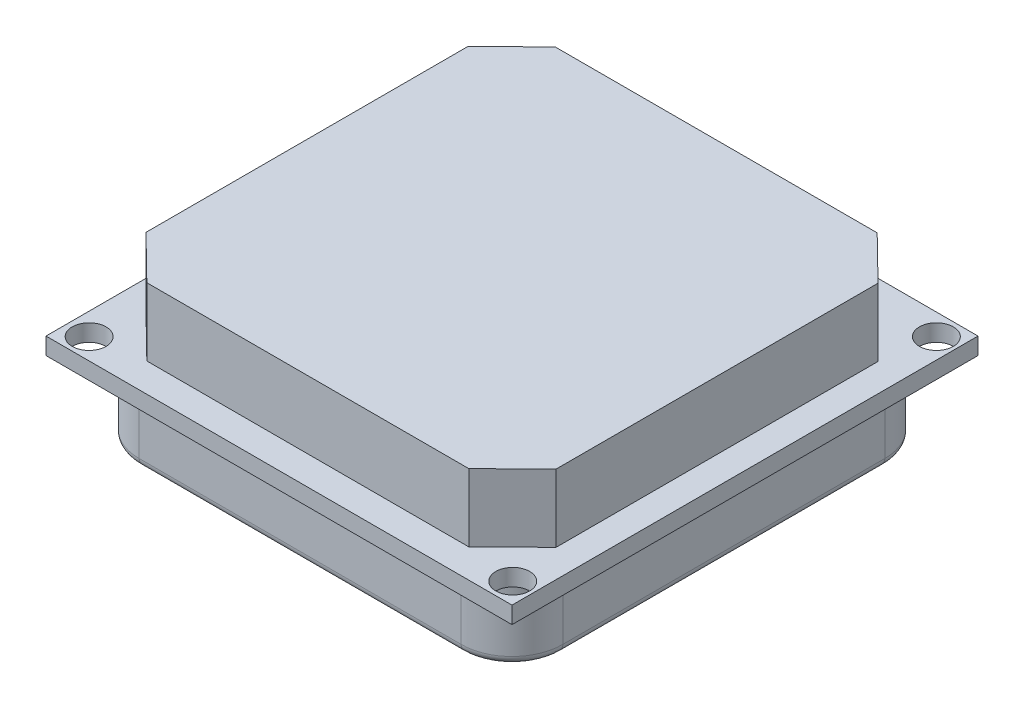
ISO-10303-21;
HEADER;
FILE_DESCRIPTION(('STEP AP214'),'2;1');
FILE_NAME('part.step','',(''),(''),'','','');
FILE_SCHEMA(('AUTOMOTIVE_DESIGN { 1 0 10303 214 1 1 1 1 }'));
ENDSEC;
DATA;
#1=APPLICATION_CONTEXT('core data for automotive mechanical design processes');
#2=APPLICATION_PROTOCOL_DEFINITION('international standard','automotive_design',2000,#1);
#3=PRODUCT_CONTEXT('',#1,'mechanical');
#4=PRODUCT('Part','Part','',(#3));
#5=PRODUCT_RELATED_PRODUCT_CATEGORY('part','',(#4));
#6=PRODUCT_DEFINITION_FORMATION('','',#4);
#7=PRODUCT_DEFINITION_CONTEXT('part definition',#1,'design');
#8=PRODUCT_DEFINITION('design','',#6,#7);
#9=PRODUCT_DEFINITION_SHAPE('','',#8);
#10=(LENGTH_UNIT() NAMED_UNIT(*) SI_UNIT(.MILLI.,.METRE.));
#11=(NAMED_UNIT(*) PLANE_ANGLE_UNIT() SI_UNIT($,.RADIAN.));
#12=(NAMED_UNIT(*) SI_UNIT($,.STERADIAN.) SOLID_ANGLE_UNIT());
#13=UNCERTAINTY_MEASURE_WITH_UNIT(LENGTH_MEASURE(1.E-05),#10,'distance_accuracy_value','');
#14=(GEOMETRIC_REPRESENTATION_CONTEXT(3) GLOBAL_UNCERTAINTY_ASSIGNED_CONTEXT((#13)) GLOBAL_UNIT_ASSIGNED_CONTEXT((#10,
#11,#12)) REPRESENTATION_CONTEXT('',''));
#15=CARTESIAN_POINT('',(0.,0.,0.));
#16=DIRECTION('',(0.,0.,1.));
#17=DIRECTION('',(1.,0.,0.));
#18=AXIS2_PLACEMENT_3D('',#15,#16,#17);
#19=CARTESIAN_POINT('',(0.,0.,0.));
#20=DIRECTION('',(0.,1.,0.));
#21=DIRECTION('',(0.,0.,1.));
#22=AXIS2_PLACEMENT_3D('',#19,#20,#21);
#23=PLANE('',#22);
#24=DIRECTION('',(-1.,0.,0.));
#25=VECTOR('',#24,1.);
#26=CARTESIAN_POINT('',(13.75,0.,-13.75));
#27=LINE('',#26,#25);
#28=CARTESIAN_POINT('',(13.75,0.,-13.75));
#29=VERTEX_POINT('',#28);
#30=CARTESIAN_POINT('',(-13.75,0.,-13.75));
#31=VERTEX_POINT('',#30);
#32=EDGE_CURVE('E366',#29,#31,#27,.T.);
#33=ORIENTED_EDGE('',*,*,#32,.F.);
#34=DIRECTION('',(0.,0.,-1.));
#35=VECTOR('',#34,1.);
#36=CARTESIAN_POINT('',(13.75,0.,-13.75));
#37=LINE('',#36,#35);
#38=CARTESIAN_POINT('',(13.75,0.,13.75));
#39=VERTEX_POINT('',#38);
#40=EDGE_CURVE('E375',#39,#29,#37,.T.);
#41=ORIENTED_EDGE('',*,*,#40,.F.);
#42=DIRECTION('',(1.,0.,0.));
#43=VECTOR('',#42,1.);
#44=CARTESIAN_POINT('',(13.75,0.,13.75));
#45=LINE('',#44,#43);
#46=CARTESIAN_POINT('',(-13.75,0.,13.75));
#47=VERTEX_POINT('',#46);
#48=EDGE_CURVE('E391',#47,#39,#45,.T.);
#49=ORIENTED_EDGE('',*,*,#48,.F.);
#50=DIRECTION('',(0.,0.,1.));
#51=VECTOR('',#50,1.);
#52=CARTESIAN_POINT('',(-13.75,0.,-13.75));
#53=LINE('',#52,#51);
#54=EDGE_CURVE('E388',#31,#47,#53,.T.);
#55=ORIENTED_EDGE('',*,*,#54,.F.);
#56=EDGE_LOOP('',(#33,#41,#49,#55));
#57=FACE_BOUND('',#56,.T.);
#58=CARTESIAN_POINT('',(-12.4479717343854,0.,-12.4920969026307));
#59=DIRECTION('',(0.,1.,0.));
#60=DIRECTION('',(0.,0.,1.));
#61=AXIS2_PLACEMENT_3D('',#58,#59,#60);
#62=CIRCLE('',#61,1.);
#63=CARTESIAN_POINT('',(-12.4479717343854,0.,-11.4920969026307));
#64=VERTEX_POINT('',#63);
#65=EDGE_CURVE('E362',#64,#64,#62,.T.);
#66=ORIENTED_EDGE('',*,*,#65,.T.);
#67=EDGE_LOOP('',(#66));
#68=FACE_BOUND('',#67,.T.);
#69=CARTESIAN_POINT('',(12.5520282656146,0.,-12.4920969026307));
#70=DIRECTION('',(0.,1.,0.));
#71=DIRECTION('',(0.,0.,1.));
#72=AXIS2_PLACEMENT_3D('',#69,#70,#71);
#73=CIRCLE('',#72,1.);
#74=CARTESIAN_POINT('',(12.5520282656146,0.,-11.4920969026307));
#75=VERTEX_POINT('',#74);
#76=EDGE_CURVE('E338',#75,#75,#73,.T.);
#77=ORIENTED_EDGE('',*,*,#76,.T.);
#78=EDGE_LOOP('',(#77));
#79=FACE_BOUND('',#78,.T.);
#80=CARTESIAN_POINT('',(12.5520282656146,0.,12.5079030973693));
#81=DIRECTION('',(0.,1.,0.));
#82=DIRECTION('',(0.,0.,1.));
#83=AXIS2_PLACEMENT_3D('',#80,#81,#82);
#84=CIRCLE('',#83,1.);
#85=CARTESIAN_POINT('',(12.5520282656146,0.,13.5079030973693));
#86=VERTEX_POINT('',#85);
#87=EDGE_CURVE('E347',#86,#86,#84,.T.);
#88=ORIENTED_EDGE('',*,*,#87,.T.);
#89=EDGE_LOOP('',(#88));
#90=FACE_BOUND('',#89,.T.);
#91=CARTESIAN_POINT('',(-12.4479717343854,0.,12.5079030973693));
#92=DIRECTION('',(0.,1.,0.));
#93=DIRECTION('',(0.,0.,1.));
#94=AXIS2_PLACEMENT_3D('',#91,#92,#93);
#95=CIRCLE('',#94,1.);
#96=CARTESIAN_POINT('',(-12.4479717343854,0.,13.5079030973693));
#97=VERTEX_POINT('',#96);
#98=EDGE_CURVE('E355',#97,#97,#95,.T.);
#99=ORIENTED_EDGE('',*,*,#98,.T.);
#100=EDGE_LOOP('',(#99));
#101=FACE_BOUND('',#100,.T.);
#102=CARTESIAN_POINT('',(-9.5,0.,9.5));
#103=DIRECTION('',(0.,-1.,0.));
#104=DIRECTION('',(0.,0.,1.));
#105=AXIS2_PLACEMENT_3D('',#102,#103,#104);
#106=CIRCLE('',#105,3.);
#107=CARTESIAN_POINT('',(-9.5,0.,12.5));
#108=VERTEX_POINT('',#107);
#109=CARTESIAN_POINT('',(-12.5,0.,9.5));
#110=VERTEX_POINT('',#109);
#111=EDGE_CURVE('E206',#108,#110,#106,.T.);
#112=ORIENTED_EDGE('',*,*,#111,.F.);
#113=DIRECTION('',(-1.,0.,0.));
#114=VECTOR('',#113,1.);
#115=CARTESIAN_POINT('',(-9.5,0.,12.5));
#116=LINE('',#115,#114);
#117=CARTESIAN_POINT('',(9.5,0.,12.5));
#118=VERTEX_POINT('',#117);
#119=EDGE_CURVE('E213',#118,#108,#116,.T.);
#120=ORIENTED_EDGE('',*,*,#119,.F.);
#121=CARTESIAN_POINT('',(9.5,0.,9.5));
#122=DIRECTION('',(0.,-1.,0.));
#123=DIRECTION('',(0.,0.,1.));
#124=AXIS2_PLACEMENT_3D('',#121,#122,#123);
#125=CIRCLE('',#124,3.00000000000001);
#126=CARTESIAN_POINT('',(12.5,0.,9.5));
#127=VERTEX_POINT('',#126);
#128=EDGE_CURVE('E229',#127,#118,#125,.T.);
#129=ORIENTED_EDGE('',*,*,#128,.F.);
#130=DIRECTION('',(0.,0.,1.));
#131=VECTOR('',#130,1.);
#132=CARTESIAN_POINT('',(12.5,0.,9.5));
#133=LINE('',#132,#131);
#134=CARTESIAN_POINT('',(12.5,0.,-9.5));
#135=VERTEX_POINT('',#134);
#136=EDGE_CURVE('E232',#135,#127,#133,.T.);
#137=ORIENTED_EDGE('',*,*,#136,.F.);
#138=CARTESIAN_POINT('',(9.49999999999999,0.,-9.5));
#139=DIRECTION('',(0.,-1.,0.));
#140=DIRECTION('',(0.,0.,1.));
#141=AXIS2_PLACEMENT_3D('',#138,#139,#140);
#142=CIRCLE('',#141,3.00000000000001);
#143=CARTESIAN_POINT('',(9.5,0.,-12.5));
#144=VERTEX_POINT('',#143);
#145=EDGE_CURVE('E508',#144,#135,#142,.T.);
#146=ORIENTED_EDGE('',*,*,#145,.F.);
#147=DIRECTION('',(1.,0.,0.));
#148=VECTOR('',#147,1.);
#149=CARTESIAN_POINT('',(9.5,0.,-12.5));
#150=LINE('',#149,#148);
#151=CARTESIAN_POINT('',(-9.5,0.,-12.5));
#152=VERTEX_POINT('',#151);
#153=EDGE_CURVE('E504',#152,#144,#150,.T.);
#154=ORIENTED_EDGE('',*,*,#153,.F.);
#155=CARTESIAN_POINT('',(-9.5,0.,-9.50000000000001));
#156=DIRECTION('',(0.,-1.,0.));
#157=DIRECTION('',(0.,0.,1.));
#158=AXIS2_PLACEMENT_3D('',#155,#156,#157);
#159=CIRCLE('',#158,2.99999999999999);
#160=CARTESIAN_POINT('',(-12.5,0.,-9.5));
#161=VERTEX_POINT('',#160);
#162=EDGE_CURVE('E500',#161,#152,#159,.T.);
#163=ORIENTED_EDGE('',*,*,#162,.F.);
#164=DIRECTION('',(0.,0.,-1.));
#165=VECTOR('',#164,1.);
#166=CARTESIAN_POINT('',(-12.5,0.,-9.5));
#167=LINE('',#166,#165);
#168=EDGE_CURVE('E222',#110,#161,#167,.T.);
#169=ORIENTED_EDGE('',*,*,#168,.F.);
#170=EDGE_LOOP('',(#112,#120,#129,#137,#146,#154,#163,#169));
#171=FACE_BOUND('',#170,.T.);
#172=ADVANCED_FACE('F39',(#57,#68,#79,#90,#101,#171),#23,.F.);
#173=CARTESIAN_POINT('',(0.,1.,0.));
#174=DIRECTION('',(0.,1.,0.));
#175=DIRECTION('',(0.,0.,1.));
#176=AXIS2_PLACEMENT_3D('',#173,#174,#175);
#177=PLANE('',#176);
#178=CARTESIAN_POINT('',(-12.4479717343854,1.,12.5079030973693));
#179=DIRECTION('',(0.,1.,0.));
#180=DIRECTION('',(0.,0.,1.));
#181=AXIS2_PLACEMENT_3D('',#178,#179,#180);
#182=CIRCLE('',#181,1.);
#183=CARTESIAN_POINT('',(-12.4479717343854,1.,13.5079030973693));
#184=VERTEX_POINT('',#183);
#185=EDGE_CURVE('E337',#184,#184,#182,.T.);
#186=ORIENTED_EDGE('',*,*,#185,.F.);
#187=EDGE_LOOP('',(#186));
#188=FACE_BOUND('',#187,.T.);
#189=CARTESIAN_POINT('',(12.5520282656146,1.,12.5079030973693));
#190=DIRECTION('',(0.,1.,0.));
#191=DIRECTION('',(0.,0.,1.));
#192=AXIS2_PLACEMENT_3D('',#189,#190,#191);
#193=CIRCLE('',#192,1.);
#194=CARTESIAN_POINT('',(12.5520282656146,1.,13.5079030973693));
#195=VERTEX_POINT('',#194);
#196=EDGE_CURVE('E351',#195,#195,#193,.T.);
#197=ORIENTED_EDGE('',*,*,#196,.F.);
#198=EDGE_LOOP('',(#197));
#199=FACE_BOUND('',#198,.T.);
#200=CARTESIAN_POINT('',(12.5520282656146,1.,-12.4920969026307));
#201=DIRECTION('',(0.,1.,0.));
#202=DIRECTION('',(0.,0.,1.));
#203=AXIS2_PLACEMENT_3D('',#200,#201,#202);
#204=CIRCLE('',#203,1.);
#205=CARTESIAN_POINT('',(12.5520282656146,1.,-11.4920969026307));
#206=VERTEX_POINT('',#205);
#207=EDGE_CURVE('E343',#206,#206,#204,.T.);
#208=ORIENTED_EDGE('',*,*,#207,.F.);
#209=EDGE_LOOP('',(#208));
#210=FACE_BOUND('',#209,.T.);
#211=CARTESIAN_POINT('',(-12.4479717343854,1.,-12.4920969026307));
#212=DIRECTION('',(0.,1.,0.));
#213=DIRECTION('',(0.,0.,1.));
#214=AXIS2_PLACEMENT_3D('',#211,#212,#213);
#215=CIRCLE('',#214,1.);
#216=CARTESIAN_POINT('',(-12.4479717343854,1.,-11.4920969026307));
#217=VERTEX_POINT('',#216);
#218=EDGE_CURVE('E342',#217,#217,#215,.T.);
#219=ORIENTED_EDGE('',*,*,#218,.F.);
#220=EDGE_LOOP('',(#219));
#221=FACE_BOUND('',#220,.T.);
#222=DIRECTION('',(-1.,0.,0.));
#223=VECTOR('',#222,1.);
#224=CARTESIAN_POINT('',(13.75,1.,-13.75));
#225=LINE('',#224,#223);
#226=CARTESIAN_POINT('',(13.75,1.,-13.75));
#227=VERTEX_POINT('',#226);
#228=CARTESIAN_POINT('',(-13.75,1.,-13.75));
#229=VERTEX_POINT('',#228);
#230=EDGE_CURVE('E370',#227,#229,#225,.T.);
#231=ORIENTED_EDGE('',*,*,#230,.T.);
#232=DIRECTION('',(0.,0.,1.));
#233=VECTOR('',#232,1.);
#234=CARTESIAN_POINT('',(-13.75,1.,-13.75));
#235=LINE('',#234,#233);
#236=CARTESIAN_POINT('',(-13.75,1.,13.75));
#237=VERTEX_POINT('',#236);
#238=EDGE_CURVE('E374',#229,#237,#235,.T.);
#239=ORIENTED_EDGE('',*,*,#238,.T.);
#240=DIRECTION('',(1.,0.,0.));
#241=VECTOR('',#240,1.);
#242=CARTESIAN_POINT('',(13.75,1.,13.75));
#243=LINE('',#242,#241);
#244=CARTESIAN_POINT('',(13.75,1.,13.75));
#245=VERTEX_POINT('',#244);
#246=EDGE_CURVE('E378',#237,#245,#243,.T.);
#247=ORIENTED_EDGE('',*,*,#246,.T.);
#248=DIRECTION('',(0.,0.,-1.));
#249=VECTOR('',#248,1.);
#250=CARTESIAN_POINT('',(13.75,1.,-13.75));
#251=LINE('',#250,#249);
#252=EDGE_CURVE('E381',#245,#227,#251,.T.);
#253=ORIENTED_EDGE('',*,*,#252,.T.);
#254=EDGE_LOOP('',(#231,#239,#247,#253));
#255=FACE_BOUND('',#254,.T.);
#256=DIRECTION('',(0.713938248596245,0.,0.700208666892468));
#257=VECTOR('',#256,1.);
#258=CARTESIAN_POINT('',(-12.1,1.,9.5));
#259=LINE('',#258,#257);
#260=CARTESIAN_POINT('',(-12.1,1.,9.5));
#261=VERTEX_POINT('',#260);
#262=CARTESIAN_POINT('',(-9.49999999999999,1.,12.05));
#263=VERTEX_POINT('',#262);
#264=EDGE_CURVE('E287',#261,#263,#259,.T.);
#265=ORIENTED_EDGE('',*,*,#264,.F.);
#266=DIRECTION('',(0.,0.,1.));
#267=VECTOR('',#266,1.);
#268=CARTESIAN_POINT('',(-12.1,1.,-9.5));
#269=LINE('',#268,#267);
#270=CARTESIAN_POINT('',(-12.1,1.,-9.5));
#271=VERTEX_POINT('',#270);
#272=EDGE_CURVE('E256',#271,#261,#269,.T.);
#273=ORIENTED_EDGE('',*,*,#272,.F.);
#274=DIRECTION('',(-0.713938248596244,0.,0.700208666892468));
#275=VECTOR('',#274,1.);
#276=CARTESIAN_POINT('',(-9.49999999999999,1.,-12.05));
#277=LINE('',#276,#275);
#278=CARTESIAN_POINT('',(-9.49999999999999,1.,-12.05));
#279=VERTEX_POINT('',#278);
#280=EDGE_CURVE('E262',#279,#271,#277,.T.);
#281=ORIENTED_EDGE('',*,*,#280,.F.);
#282=DIRECTION('',(-1.,0.,0.));
#283=VECTOR('',#282,1.);
#284=CARTESIAN_POINT('',(9.5,1.,-12.05));
#285=LINE('',#284,#283);
#286=CARTESIAN_POINT('',(9.5,1.,-12.05));
#287=VERTEX_POINT('',#286);
#288=EDGE_CURVE('E302',#287,#279,#285,.T.);
#289=ORIENTED_EDGE('',*,*,#288,.F.);
#290=DIRECTION('',(-0.713938248596244,0.,-0.700208666892468));
#291=VECTOR('',#290,1.);
#292=CARTESIAN_POINT('',(12.1,1.,-9.50000000000001));
#293=LINE('',#292,#291);
#294=CARTESIAN_POINT('',(12.1,1.,-9.50000000000001));
#295=VERTEX_POINT('',#294);
#296=EDGE_CURVE('E299',#295,#287,#293,.T.);
#297=ORIENTED_EDGE('',*,*,#296,.F.);
#298=DIRECTION('',(0.,0.,-1.));
#299=VECTOR('',#298,1.);
#300=CARTESIAN_POINT('',(12.1,1.,9.49999999999999));
#301=LINE('',#300,#299);
#302=CARTESIAN_POINT('',(12.1,1.,9.49999999999999));
#303=VERTEX_POINT('',#302);
#304=EDGE_CURVE('E296',#303,#295,#301,.T.);
#305=ORIENTED_EDGE('',*,*,#304,.F.);
#306=DIRECTION('',(0.713938248596243,0.,-0.700208666892469));
#307=VECTOR('',#306,1.);
#308=CARTESIAN_POINT('',(9.5,1.,12.05));
#309=LINE('',#308,#307);
#310=CARTESIAN_POINT('',(9.5,1.,12.05));
#311=VERTEX_POINT('',#310);
#312=EDGE_CURVE('E293',#311,#303,#309,.T.);
#313=ORIENTED_EDGE('',*,*,#312,.F.);
#314=DIRECTION('',(1.,0.,0.));
#315=VECTOR('',#314,1.);
#316=CARTESIAN_POINT('',(-9.49999999999999,1.,12.05));
#317=LINE('',#316,#315);
#318=EDGE_CURVE('E290',#263,#311,#317,.T.);
#319=ORIENTED_EDGE('',*,*,#318,.F.);
#320=EDGE_LOOP('',(#265,#273,#281,#289,#297,#305,#313,#319));
#321=FACE_BOUND('',#320,.T.);
#322=ADVANCED_FACE('F573',(#188,#199,#210,#221,#255,#321),#177,.T.);
#323=CARTESIAN_POINT('',(13.75,1.,-13.75));
#324=DIRECTION('',(0.,0.,1.));
#325=DIRECTION('',(1.,0.,0.));
#326=AXIS2_PLACEMENT_3D('',#323,#324,#325);
#327=PLANE('',#326);
#328=ORIENTED_EDGE('',*,*,#32,.T.);
#329=DIRECTION('',(0.,-1.,0.));
#330=VECTOR('',#329,1.);
#331=CARTESIAN_POINT('',(-13.75,1.,-13.75));
#332=LINE('',#331,#330);
#333=EDGE_CURVE('E407',#229,#31,#332,.T.);
#334=ORIENTED_EDGE('',*,*,#333,.F.);
#335=ORIENTED_EDGE('',*,*,#230,.F.);
#336=DIRECTION('',(0.,-1.,0.));
#337=VECTOR('',#336,1.);
#338=CARTESIAN_POINT('',(13.75,1.,-13.75));
#339=LINE('',#338,#337);
#340=EDGE_CURVE('E384',#227,#29,#339,.T.);
#341=ORIENTED_EDGE('',*,*,#340,.T.);
#342=EDGE_LOOP('',(#328,#334,#335,#341));
#343=FACE_BOUND('',#342,.T.);
#344=ADVANCED_FACE('F579',(#343),#327,.F.);
#345=CARTESIAN_POINT('',(-13.75,1.,-13.75));
#346=DIRECTION('',(1.,0.,0.));
#347=DIRECTION('',(0.,0.,-1.));
#348=AXIS2_PLACEMENT_3D('',#345,#346,#347);
#349=PLANE('',#348);
#350=ORIENTED_EDGE('',*,*,#54,.T.);
#351=DIRECTION('',(0.,-1.,0.));
#352=VECTOR('',#351,1.);
#353=CARTESIAN_POINT('',(-13.75,1.,13.75));
#354=LINE('',#353,#352);
#355=EDGE_CURVE('E403',#237,#47,#354,.T.);
#356=ORIENTED_EDGE('',*,*,#355,.F.);
#357=ORIENTED_EDGE('',*,*,#238,.F.);
#358=ORIENTED_EDGE('',*,*,#333,.T.);
#359=EDGE_LOOP('',(#350,#356,#357,#358));
#360=FACE_BOUND('',#359,.T.);
#361=ADVANCED_FACE('F594',(#360),#349,.F.);
#362=CARTESIAN_POINT('',(13.75,1.,13.75));
#363=DIRECTION('',(0.,0.,-1.));
#364=DIRECTION('',(-1.,0.,0.));
#365=AXIS2_PLACEMENT_3D('',#362,#363,#364);
#366=PLANE('',#365);
#367=ORIENTED_EDGE('',*,*,#48,.T.);
#368=DIRECTION('',(0.,-1.,0.));
#369=VECTOR('',#368,1.);
#370=CARTESIAN_POINT('',(13.75,1.,13.75));
#371=LINE('',#370,#369);
#372=EDGE_CURVE('E399',#245,#39,#371,.T.);
#373=ORIENTED_EDGE('',*,*,#372,.F.);
#374=ORIENTED_EDGE('',*,*,#246,.F.);
#375=ORIENTED_EDGE('',*,*,#355,.T.);
#376=EDGE_LOOP('',(#367,#373,#374,#375));
#377=FACE_BOUND('',#376,.T.);
#378=ADVANCED_FACE('F590',(#377),#366,.F.);
#379=CARTESIAN_POINT('',(13.75,1.,-13.75));
#380=DIRECTION('',(-1.,0.,0.));
#381=DIRECTION('',(0.,0.,1.));
#382=AXIS2_PLACEMENT_3D('',#379,#380,#381);
#383=PLANE('',#382);
#384=ORIENTED_EDGE('',*,*,#40,.T.);
#385=ORIENTED_EDGE('',*,*,#340,.F.);
#386=ORIENTED_EDGE('',*,*,#252,.F.);
#387=ORIENTED_EDGE('',*,*,#372,.T.);
#388=EDGE_LOOP('',(#384,#385,#386,#387));
#389=FACE_BOUND('',#388,.T.);
#390=ADVANCED_FACE('F586',(#389),#383,.F.);
#391=CARTESIAN_POINT('',(-12.4479717343854,0.,-12.4920969026307));
#392=DIRECTION('',(0.,1.,0.));
#393=DIRECTION('',(0.,0.,1.));
#394=AXIS2_PLACEMENT_3D('',#391,#392,#393);
#395=CYLINDRICAL_SURFACE('',#394,1.);
#396=ORIENTED_EDGE('',*,*,#65,.F.);
#397=EDGE_LOOP('',(#396));
#398=FACE_BOUND('',#397,.T.);
#399=ORIENTED_EDGE('',*,*,#218,.T.);
#400=EDGE_LOOP('',(#399));
#401=FACE_BOUND('',#400,.T.);
#402=ADVANCED_FACE('F589',(#398,#401),#395,.F.);
#403=CARTESIAN_POINT('',(12.5520282656146,0.,-12.4920969026307));
#404=DIRECTION('',(0.,1.,0.));
#405=DIRECTION('',(0.,0.,1.));
#406=AXIS2_PLACEMENT_3D('',#403,#404,#405);
#407=CYLINDRICAL_SURFACE('',#406,1.);
#408=ORIENTED_EDGE('',*,*,#76,.F.);
#409=EDGE_LOOP('',(#408));
#410=FACE_BOUND('',#409,.T.);
#411=ORIENTED_EDGE('',*,*,#207,.T.);
#412=EDGE_LOOP('',(#411));
#413=FACE_BOUND('',#412,.T.);
#414=ADVANCED_FACE('F741',(#410,#413),#407,.F.);
#415=CARTESIAN_POINT('',(12.5520282656146,0.,12.5079030973693));
#416=DIRECTION('',(0.,1.,0.));
#417=DIRECTION('',(0.,0.,1.));
#418=AXIS2_PLACEMENT_3D('',#415,#416,#417);
#419=CYLINDRICAL_SURFACE('',#418,1.);
#420=ORIENTED_EDGE('',*,*,#87,.F.);
#421=EDGE_LOOP('',(#420));
#422=FACE_BOUND('',#421,.T.);
#423=ORIENTED_EDGE('',*,*,#196,.T.);
#424=EDGE_LOOP('',(#423));
#425=FACE_BOUND('',#424,.T.);
#426=ADVANCED_FACE('F744',(#422,#425),#419,.F.);
#427=CARTESIAN_POINT('',(-12.4479717343854,0.,12.5079030973693));
#428=DIRECTION('',(0.,1.,0.));
#429=DIRECTION('',(0.,0.,1.));
#430=AXIS2_PLACEMENT_3D('',#427,#428,#429);
#431=CYLINDRICAL_SURFACE('',#430,1.);
#432=ORIENTED_EDGE('',*,*,#98,.F.);
#433=EDGE_LOOP('',(#432));
#434=FACE_BOUND('',#433,.T.);
#435=ORIENTED_EDGE('',*,*,#185,.T.);
#436=EDGE_LOOP('',(#435));
#437=FACE_BOUND('',#436,.T.);
#438=ADVANCED_FACE('F739',(#434,#437),#431,.F.);
#439=CARTESIAN_POINT('',(-12.1,5.,-9.5));
#440=DIRECTION('',(1.,0.,0.));
#441=DIRECTION('',(0.,0.,-1.));
#442=AXIS2_PLACEMENT_3D('',#439,#440,#441);
#443=PLANE('',#442);
#444=ORIENTED_EDGE('',*,*,#272,.T.);
#445=DIRECTION('',(0.,-1.,0.));
#446=VECTOR('',#445,1.);
#447=CARTESIAN_POINT('',(-12.1,5.,9.5));
#448=LINE('',#447,#446);
#449=CARTESIAN_POINT('',(-12.1,5.,9.5));
#450=VERTEX_POINT('',#449);
#451=EDGE_CURVE('E334',#450,#261,#448,.T.);
#452=ORIENTED_EDGE('',*,*,#451,.F.);
#453=DIRECTION('',(0.,0.,1.));
#454=VECTOR('',#453,1.);
#455=CARTESIAN_POINT('',(-12.1,5.,-9.5));
#456=LINE('',#455,#454);
#457=CARTESIAN_POINT('',(-12.1,5.,-9.5));
#458=VERTEX_POINT('',#457);
#459=EDGE_CURVE('E257',#458,#450,#456,.T.);
#460=ORIENTED_EDGE('',*,*,#459,.F.);
#461=DIRECTION('',(0.,-1.,0.));
#462=VECTOR('',#461,1.);
#463=CARTESIAN_POINT('',(-12.1,5.,-9.5));
#464=LINE('',#463,#462);
#465=EDGE_CURVE('E283',#458,#271,#464,.T.);
#466=ORIENTED_EDGE('',*,*,#465,.T.);
#467=EDGE_LOOP('',(#444,#452,#460,#466));
#468=FACE_BOUND('',#467,.T.);
#469=ADVANCED_FACE('F735',(#468),#443,.F.);
#470=CARTESIAN_POINT('',(-12.1,5.,9.5));
#471=DIRECTION('',(0.700208666892468,0.,-0.713938248596245));
#472=DIRECTION('',(-0.713938248596245,0.,-0.700208666892468));
#473=AXIS2_PLACEMENT_3D('',#470,#471,#472);
#474=PLANE('',#473);
#475=ORIENTED_EDGE('',*,*,#264,.T.);
#476=DIRECTION('',(0.,-1.,0.));
#477=VECTOR('',#476,1.);
#478=CARTESIAN_POINT('',(-9.49999999999999,5.,12.05));
#479=LINE('',#478,#477);
#480=CARTESIAN_POINT('',(-9.49999999999999,5.,12.05));
#481=VERTEX_POINT('',#480);
#482=EDGE_CURVE('E330',#481,#263,#479,.T.);
#483=ORIENTED_EDGE('',*,*,#482,.F.);
#484=DIRECTION('',(0.713938248596245,0.,0.700208666892468));
#485=VECTOR('',#484,1.);
#486=CARTESIAN_POINT('',(-12.1,5.,9.5));
#487=LINE('',#486,#485);
#488=EDGE_CURVE('E261',#450,#481,#487,.T.);
#489=ORIENTED_EDGE('',*,*,#488,.F.);
#490=ORIENTED_EDGE('',*,*,#451,.T.);
#491=EDGE_LOOP('',(#475,#483,#489,#490));
#492=FACE_BOUND('',#491,.T.);
#493=ADVANCED_FACE('F731',(#492),#474,.F.);
#494=CARTESIAN_POINT('',(-9.49999999999999,5.,12.05));
#495=DIRECTION('',(0.,0.,-1.));
#496=DIRECTION('',(-1.,0.,0.));
#497=AXIS2_PLACEMENT_3D('',#494,#495,#496);
#498=PLANE('',#497);
#499=ORIENTED_EDGE('',*,*,#318,.T.);
#500=DIRECTION('',(0.,-1.,0.));
#501=VECTOR('',#500,1.);
#502=CARTESIAN_POINT('',(9.5,5.,12.05));
#503=LINE('',#502,#501);
#504=CARTESIAN_POINT('',(9.5,5.,12.05));
#505=VERTEX_POINT('',#504);
#506=EDGE_CURVE('E326',#505,#311,#503,.T.);
#507=ORIENTED_EDGE('',*,*,#506,.F.);
#508=DIRECTION('',(1.,0.,0.));
#509=VECTOR('',#508,1.);
#510=CARTESIAN_POINT('',(-9.49999999999999,5.,12.05));
#511=LINE('',#510,#509);
#512=EDGE_CURVE('E265',#481,#505,#511,.T.);
#513=ORIENTED_EDGE('',*,*,#512,.F.);
#514=ORIENTED_EDGE('',*,*,#482,.T.);
#515=EDGE_LOOP('',(#499,#507,#513,#514));
#516=FACE_BOUND('',#515,.T.);
#517=ADVANCED_FACE('F727',(#516),#498,.F.);
#518=CARTESIAN_POINT('',(9.5,5.,12.05));
#519=DIRECTION('',(-0.700208666892469,0.,-0.713938248596243));
#520=DIRECTION('',(-0.713938248596243,0.,0.700208666892469));
#521=AXIS2_PLACEMENT_3D('',#518,#519,#520);
#522=PLANE('',#521);
#523=ORIENTED_EDGE('',*,*,#312,.T.);
#524=DIRECTION('',(0.,-1.,0.));
#525=VECTOR('',#524,1.);
#526=CARTESIAN_POINT('',(12.1,5.,9.49999999999999));
#527=LINE('',#526,#525);
#528=CARTESIAN_POINT('',(12.1,5.,9.49999999999999));
#529=VERTEX_POINT('',#528);
#530=EDGE_CURVE('E322',#529,#303,#527,.T.);
#531=ORIENTED_EDGE('',*,*,#530,.F.);
#532=DIRECTION('',(0.713938248596243,0.,-0.700208666892469));
#533=VECTOR('',#532,1.);
#534=CARTESIAN_POINT('',(9.5,5.,12.05));
#535=LINE('',#534,#533);
#536=EDGE_CURVE('E268',#505,#529,#535,.T.);
#537=ORIENTED_EDGE('',*,*,#536,.F.);
#538=ORIENTED_EDGE('',*,*,#506,.T.);
#539=EDGE_LOOP('',(#523,#531,#537,#538));
#540=FACE_BOUND('',#539,.T.);
#541=ADVANCED_FACE('F723',(#540),#522,.F.);
#542=CARTESIAN_POINT('',(12.1,5.,9.49999999999999));
#543=DIRECTION('',(-1.,0.,0.));
#544=DIRECTION('',(0.,0.,1.));
#545=AXIS2_PLACEMENT_3D('',#542,#543,#544);
#546=PLANE('',#545);
#547=ORIENTED_EDGE('',*,*,#304,.T.);
#548=DIRECTION('',(0.,-1.,0.));
#549=VECTOR('',#548,1.);
#550=CARTESIAN_POINT('',(12.1,5.,-9.50000000000001));
#551=LINE('',#550,#549);
#552=CARTESIAN_POINT('',(12.1,5.,-9.50000000000001));
#553=VERTEX_POINT('',#552);
#554=EDGE_CURVE('E318',#553,#295,#551,.T.);
#555=ORIENTED_EDGE('',*,*,#554,.F.);
#556=DIRECTION('',(0.,0.,-1.));
#557=VECTOR('',#556,1.);
#558=CARTESIAN_POINT('',(12.1,5.,9.49999999999999));
#559=LINE('',#558,#557);
#560=EDGE_CURVE('E271',#529,#553,#559,.T.);
#561=ORIENTED_EDGE('',*,*,#560,.F.);
#562=ORIENTED_EDGE('',*,*,#530,.T.);
#563=EDGE_LOOP('',(#547,#555,#561,#562));
#564=FACE_BOUND('',#563,.T.);
#565=ADVANCED_FACE('F719',(#564),#546,.F.);
#566=CARTESIAN_POINT('',(12.1,5.,-9.50000000000001));
#567=DIRECTION('',(-0.700208666892468,0.,0.713938248596244));
#568=DIRECTION('',(0.713938248596244,0.,0.700208666892468));
#569=AXIS2_PLACEMENT_3D('',#566,#567,#568);
#570=PLANE('',#569);
#571=ORIENTED_EDGE('',*,*,#296,.T.);
#572=DIRECTION('',(0.,-1.,0.));
#573=VECTOR('',#572,1.);
#574=CARTESIAN_POINT('',(9.5,5.,-12.05));
#575=LINE('',#574,#573);
#576=CARTESIAN_POINT('',(9.5,5.,-12.05));
#577=VERTEX_POINT('',#576);
#578=EDGE_CURVE('E314',#577,#287,#575,.T.);
#579=ORIENTED_EDGE('',*,*,#578,.F.);
#580=DIRECTION('',(-0.713938248596244,0.,-0.700208666892468));
#581=VECTOR('',#580,1.);
#582=CARTESIAN_POINT('',(12.1,5.,-9.50000000000001));
#583=LINE('',#582,#581);
#584=EDGE_CURVE('E274',#553,#577,#583,.T.);
#585=ORIENTED_EDGE('',*,*,#584,.F.);
#586=ORIENTED_EDGE('',*,*,#554,.T.);
#587=EDGE_LOOP('',(#571,#579,#585,#586));
#588=FACE_BOUND('',#587,.T.);
#589=ADVANCED_FACE('F715',(#588),#570,.F.);
#590=CARTESIAN_POINT('',(9.5,5.,-12.05));
#591=DIRECTION('',(0.,0.,1.));
#592=DIRECTION('',(1.,0.,0.));
#593=AXIS2_PLACEMENT_3D('',#590,#591,#592);
#594=PLANE('',#593);
#595=ORIENTED_EDGE('',*,*,#288,.T.);
#596=DIRECTION('',(0.,-1.,0.));
#597=VECTOR('',#596,1.);
#598=CARTESIAN_POINT('',(-9.49999999999999,5.,-12.05));
#599=LINE('',#598,#597);
#600=CARTESIAN_POINT('',(-9.49999999999999,5.,-12.05));
#601=VERTEX_POINT('',#600);
#602=EDGE_CURVE('E311',#601,#279,#599,.T.);
#603=ORIENTED_EDGE('',*,*,#602,.F.);
#604=DIRECTION('',(-1.,0.,0.));
#605=VECTOR('',#604,1.);
#606=CARTESIAN_POINT('',(9.5,5.,-12.05));
#607=LINE('',#606,#605);
#608=EDGE_CURVE('E277',#577,#601,#607,.T.);
#609=ORIENTED_EDGE('',*,*,#608,.F.);
#610=ORIENTED_EDGE('',*,*,#578,.T.);
#611=EDGE_LOOP('',(#595,#603,#609,#610));
#612=FACE_BOUND('',#611,.T.);
#613=ADVANCED_FACE('F711',(#612),#594,.F.);
#614=CARTESIAN_POINT('',(-9.49999999999999,5.,-12.05));
#615=DIRECTION('',(0.700208666892468,0.,0.713938248596244));
#616=DIRECTION('',(0.713938248596244,0.,-0.700208666892468));
#617=AXIS2_PLACEMENT_3D('',#614,#615,#616);
#618=PLANE('',#617);
#619=ORIENTED_EDGE('',*,*,#280,.T.);
#620=ORIENTED_EDGE('',*,*,#465,.F.);
#621=DIRECTION('',(-0.713938248596244,0.,0.700208666892468));
#622=VECTOR('',#621,1.);
#623=CARTESIAN_POINT('',(-9.49999999999999,5.,-12.05));
#624=LINE('',#623,#622);
#625=EDGE_CURVE('E280',#601,#458,#624,.T.);
#626=ORIENTED_EDGE('',*,*,#625,.F.);
#627=ORIENTED_EDGE('',*,*,#602,.T.);
#628=EDGE_LOOP('',(#619,#620,#626,#627));
#629=FACE_BOUND('',#628,.T.);
#630=ADVANCED_FACE('F707',(#629),#618,.F.);
#631=CARTESIAN_POINT('',(0.,5.,0.));
#632=DIRECTION('',(0.,1.,0.));
#633=DIRECTION('',(0.,0.,1.));
#634=AXIS2_PLACEMENT_3D('',#631,#632,#633);
#635=PLANE('',#634);
#636=ORIENTED_EDGE('',*,*,#459,.T.);
#637=ORIENTED_EDGE('',*,*,#488,.T.);
#638=ORIENTED_EDGE('',*,*,#512,.T.);
#639=ORIENTED_EDGE('',*,*,#536,.T.);
#640=ORIENTED_EDGE('',*,*,#560,.T.);
#641=ORIENTED_EDGE('',*,*,#584,.T.);
#642=ORIENTED_EDGE('',*,*,#608,.T.);
#643=ORIENTED_EDGE('',*,*,#625,.T.);
#644=EDGE_LOOP('',(#636,#637,#638,#639,#640,#641,#642,#643));
#645=FACE_BOUND('',#644,.T.);
#646=ADVANCED_FACE('F635',(#645),#635,.T.);
#647=CARTESIAN_POINT('',(-9.5,-4.26,9.5));
#648=DIRECTION('',(0.,1.,0.));
#649=DIRECTION('',(0.,0.,1.));
#650=AXIS2_PLACEMENT_3D('',#647,#648,#649);
#651=CYLINDRICAL_SURFACE('',#650,3.);
#652=DIRECTION('',(0.,1.,0.));
#653=VECTOR('',#652,1.);
#654=CARTESIAN_POINT('',(-12.5,-4.26,9.5));
#655=LINE('',#654,#653);
#656=CARTESIAN_POINT('',(-12.5,-3.76,9.5));
#657=VERTEX_POINT('',#656);
#658=EDGE_CURVE('E253',#657,#110,#655,.T.);
#659=ORIENTED_EDGE('',*,*,#658,.F.);
#660=CARTESIAN_POINT('',(-9.5,-3.76,9.5));
#661=DIRECTION('',(0.,1.,0.));
#662=DIRECTION('',(0.,0.,1.));
#663=AXIS2_PLACEMENT_3D('',#660,#661,#662);
#664=CIRCLE('',#663,3.);
#665=CARTESIAN_POINT('',(-9.5,-3.76,12.5));
#666=VERTEX_POINT('',#665);
#667=EDGE_CURVE('E208',#657,#666,#664,.T.);
#668=ORIENTED_EDGE('',*,*,#667,.T.);
#669=DIRECTION('',(0.,1.,0.));
#670=VECTOR('',#669,1.);
#671=CARTESIAN_POINT('',(-9.5,-4.26,12.5));
#672=LINE('',#671,#670);
#673=EDGE_CURVE('E202',#666,#108,#672,.T.);
#674=ORIENTED_EDGE('',*,*,#673,.T.);
#675=ORIENTED_EDGE('',*,*,#111,.T.);
#676=EDGE_LOOP('',(#659,#668,#674,#675));
#677=FACE_BOUND('',#676,.T.);
#678=ADVANCED_FACE('F205',(#677),#651,.T.);
#679=CARTESIAN_POINT('',(-12.5,-4.26,-9.5));
#680=DIRECTION('',(1.,0.,0.));
#681=DIRECTION('',(0.,0.,-1.));
#682=AXIS2_PLACEMENT_3D('',#679,#680,#681);
#683=PLANE('',#682);
#684=DIRECTION('',(0.,1.,0.));
#685=VECTOR('',#684,1.);
#686=CARTESIAN_POINT('',(-12.5,-4.26,-9.5));
#687=LINE('',#686,#685);
#688=CARTESIAN_POINT('',(-12.5,-3.76,-9.5));
#689=VERTEX_POINT('',#688);
#690=EDGE_CURVE('E250',#689,#161,#687,.T.);
#691=ORIENTED_EDGE('',*,*,#690,.F.);
#692=DIRECTION('',(0.,0.,-1.));
#693=VECTOR('',#692,1.);
#694=CARTESIAN_POINT('',(-12.5,-3.76,-9.5));
#695=LINE('',#694,#693);
#696=EDGE_CURVE('E451',#689,#657,#695,.F.);
#697=ORIENTED_EDGE('',*,*,#696,.T.);
#698=ORIENTED_EDGE('',*,*,#658,.T.);
#699=ORIENTED_EDGE('',*,*,#168,.T.);
#700=EDGE_LOOP('',(#691,#697,#698,#699));
#701=FACE_BOUND('',#700,.T.);
#702=ADVANCED_FACE('F538',(#701),#683,.F.);
#703=CARTESIAN_POINT('',(-9.5,-4.26,-9.50000000000001));
#704=DIRECTION('',(0.,1.,0.));
#705=DIRECTION('',(0.,0.,1.));
#706=AXIS2_PLACEMENT_3D('',#703,#704,#705);
#707=CYLINDRICAL_SURFACE('',#706,2.99999999999999);
#708=DIRECTION('',(0.,1.,0.));
#709=VECTOR('',#708,1.);
#710=CARTESIAN_POINT('',(-9.5,-4.26,-12.5));
#711=LINE('',#710,#709);
#712=CARTESIAN_POINT('',(-9.5,-3.76,-12.5));
#713=VERTEX_POINT('',#712);
#714=EDGE_CURVE('E247',#713,#152,#711,.T.);
#715=ORIENTED_EDGE('',*,*,#714,.F.);
#716=CARTESIAN_POINT('',(-9.5,-3.76,-9.50000000000001));
#717=DIRECTION('',(0.,1.,0.));
#718=DIRECTION('',(0.,0.,1.));
#719=AXIS2_PLACEMENT_3D('',#716,#717,#718);
#720=CIRCLE('',#719,2.99999999999999);
#721=EDGE_CURVE('E49',#713,#689,#720,.T.);
#722=ORIENTED_EDGE('',*,*,#721,.T.);
#723=ORIENTED_EDGE('',*,*,#690,.T.);
#724=ORIENTED_EDGE('',*,*,#162,.T.);
#725=EDGE_LOOP('',(#715,#722,#723,#724));
#726=FACE_BOUND('',#725,.T.);
#727=ADVANCED_FACE('F646',(#726),#707,.T.);
#728=CARTESIAN_POINT('',(9.5,-4.26,-12.5));
#729=DIRECTION('',(0.,0.,1.));
#730=DIRECTION('',(1.,0.,0.));
#731=AXIS2_PLACEMENT_3D('',#728,#729,#730);
#732=PLANE('',#731);
#733=DIRECTION('',(0.,1.,0.));
#734=VECTOR('',#733,1.);
#735=CARTESIAN_POINT('',(9.5,-4.26,-12.5));
#736=LINE('',#735,#734);
#737=CARTESIAN_POINT('',(9.5,-3.76,-12.5));
#738=VERTEX_POINT('',#737);
#739=EDGE_CURVE('E244',#738,#144,#736,.T.);
#740=ORIENTED_EDGE('',*,*,#739,.F.);
#741=DIRECTION('',(1.,0.,0.));
#742=VECTOR('',#741,1.);
#743=CARTESIAN_POINT('',(9.5,-3.76,-12.5));
#744=LINE('',#743,#742);
#745=EDGE_CURVE('E11',#738,#713,#744,.F.);
#746=ORIENTED_EDGE('',*,*,#745,.T.);
#747=ORIENTED_EDGE('',*,*,#714,.T.);
#748=ORIENTED_EDGE('',*,*,#153,.T.);
#749=EDGE_LOOP('',(#740,#746,#747,#748));
#750=FACE_BOUND('',#749,.T.);
#751=ADVANCED_FACE('F523',(#750),#732,.F.);
#752=CARTESIAN_POINT('',(9.49999999999999,-4.26,-9.5));
#753=DIRECTION('',(0.,1.,0.));
#754=DIRECTION('',(0.,0.,1.));
#755=AXIS2_PLACEMENT_3D('',#752,#753,#754);
#756=CYLINDRICAL_SURFACE('',#755,3.00000000000001);
#757=DIRECTION('',(0.,1.,0.));
#758=VECTOR('',#757,1.);
#759=CARTESIAN_POINT('',(12.5,-4.26,-9.5));
#760=LINE('',#759,#758);
#761=CARTESIAN_POINT('',(12.5,-3.76,-9.5));
#762=VERTEX_POINT('',#761);
#763=EDGE_CURVE('E241',#762,#135,#760,.T.);
#764=ORIENTED_EDGE('',*,*,#763,.F.);
#765=CARTESIAN_POINT('',(9.49999999999999,-3.76,-9.5));
#766=DIRECTION('',(0.,1.,0.));
#767=DIRECTION('',(0.,0.,1.));
#768=AXIS2_PLACEMENT_3D('',#765,#766,#767);
#769=CIRCLE('',#768,3.00000000000001);
#770=EDGE_CURVE('E448',#762,#738,#769,.T.);
#771=ORIENTED_EDGE('',*,*,#770,.T.);
#772=ORIENTED_EDGE('',*,*,#739,.T.);
#773=ORIENTED_EDGE('',*,*,#145,.T.);
#774=EDGE_LOOP('',(#764,#771,#772,#773));
#775=FACE_BOUND('',#774,.T.);
#776=ADVANCED_FACE('F521',(#775),#756,.T.);
#777=CARTESIAN_POINT('',(12.5,-4.26,9.5));
#778=DIRECTION('',(-1.,0.,0.));
#779=DIRECTION('',(0.,0.,1.));
#780=AXIS2_PLACEMENT_3D('',#777,#778,#779);
#781=PLANE('',#780);
#782=DIRECTION('',(0.,1.,0.));
#783=VECTOR('',#782,1.);
#784=CARTESIAN_POINT('',(12.5,-4.26,9.5));
#785=LINE('',#784,#783);
#786=CARTESIAN_POINT('',(12.5,-3.76,9.5));
#787=VERTEX_POINT('',#786);
#788=EDGE_CURVE('E238',#787,#127,#785,.T.);
#789=ORIENTED_EDGE('',*,*,#788,.F.);
#790=DIRECTION('',(0.,0.,1.));
#791=VECTOR('',#790,1.);
#792=CARTESIAN_POINT('',(12.5,-3.76,9.5));
#793=LINE('',#792,#791);
#794=EDGE_CURVE('E445',#787,#762,#793,.F.);
#795=ORIENTED_EDGE('',*,*,#794,.T.);
#796=ORIENTED_EDGE('',*,*,#763,.T.);
#797=ORIENTED_EDGE('',*,*,#136,.T.);
#798=EDGE_LOOP('',(#789,#795,#796,#797));
#799=FACE_BOUND('',#798,.T.);
#800=ADVANCED_FACE('F516',(#799),#781,.F.);
#801=CARTESIAN_POINT('',(9.5,-4.26,9.5));
#802=DIRECTION('',(0.,1.,0.));
#803=DIRECTION('',(0.,0.,1.));
#804=AXIS2_PLACEMENT_3D('',#801,#802,#803);
#805=CYLINDRICAL_SURFACE('',#804,3.00000000000001);
#806=DIRECTION('',(0.,1.,0.));
#807=VECTOR('',#806,1.);
#808=CARTESIAN_POINT('',(9.5,-4.26,12.5));
#809=LINE('',#808,#807);
#810=CARTESIAN_POINT('',(9.5,-3.76,12.5));
#811=VERTEX_POINT('',#810);
#812=EDGE_CURVE('E212',#811,#118,#809,.T.);
#813=ORIENTED_EDGE('',*,*,#812,.F.);
#814=CARTESIAN_POINT('',(9.5,-3.76,9.5));
#815=DIRECTION('',(0.,1.,0.));
#816=DIRECTION('',(0.,0.,1.));
#817=AXIS2_PLACEMENT_3D('',#814,#815,#816);
#818=CIRCLE('',#817,3.00000000000001);
#819=EDGE_CURVE('E442',#811,#787,#818,.T.);
#820=ORIENTED_EDGE('',*,*,#819,.T.);
#821=ORIENTED_EDGE('',*,*,#788,.T.);
#822=ORIENTED_EDGE('',*,*,#128,.T.);
#823=EDGE_LOOP('',(#813,#820,#821,#822));
#824=FACE_BOUND('',#823,.T.);
#825=ADVANCED_FACE('F550',(#824),#805,.T.);
#826=CARTESIAN_POINT('',(-9.5,-4.26,12.5));
#827=DIRECTION('',(0.,0.,-1.));
#828=DIRECTION('',(-1.,0.,0.));
#829=AXIS2_PLACEMENT_3D('',#826,#827,#828);
#830=PLANE('',#829);
#831=ORIENTED_EDGE('',*,*,#673,.F.);
#832=DIRECTION('',(-1.,0.,0.));
#833=VECTOR('',#832,1.);
#834=CARTESIAN_POINT('',(-9.5,-3.76,12.5));
#835=LINE('',#834,#833);
#836=EDGE_CURVE('E439',#666,#811,#835,.F.);
#837=ORIENTED_EDGE('',*,*,#836,.T.);
#838=ORIENTED_EDGE('',*,*,#812,.T.);
#839=ORIENTED_EDGE('',*,*,#119,.T.);
#840=EDGE_LOOP('',(#831,#837,#838,#839));
#841=FACE_BOUND('',#840,.T.);
#842=ADVANCED_FACE('F226',(#841),#830,.F.);
#843=CARTESIAN_POINT('',(-9.5,-4.26,9.5));
#844=DIRECTION('',(0.,1.,0.));
#845=DIRECTION('',(0.,0.,1.));
#846=AXIS2_PLACEMENT_3D('',#843,#844,#845);
#847=PLANE('',#846);
#848=DIRECTION('',(-1.,0.,0.));
#849=VECTOR('',#848,1.);
#850=CARTESIAN_POINT('',(-9.5,-4.26,12.));
#851=LINE('',#850,#849);
#852=CARTESIAN_POINT('',(9.5,-4.26,12.));
#853=VERTEX_POINT('',#852);
#854=CARTESIAN_POINT('',(-9.5,-4.26,12.));
#855=VERTEX_POINT('',#854);
#856=EDGE_CURVE('E430',#853,#855,#851,.T.);
#857=ORIENTED_EDGE('',*,*,#856,.T.);
#858=CARTESIAN_POINT('',(-9.5,-4.26,9.5));
#859=DIRECTION('',(0.,1.,0.));
#860=DIRECTION('',(0.,0.,1.));
#861=AXIS2_PLACEMENT_3D('',#858,#859,#860);
#862=CIRCLE('',#861,2.5);
#863=CARTESIAN_POINT('',(-12.,-4.26,9.5));
#864=VERTEX_POINT('',#863);
#865=EDGE_CURVE('E433',#855,#864,#862,.F.);
#866=ORIENTED_EDGE('',*,*,#865,.T.);
#867=DIRECTION('',(0.,0.,-1.));
#868=VECTOR('',#867,1.);
#869=CARTESIAN_POINT('',(-12.,-4.26,9.5));
#870=LINE('',#869,#868);
#871=CARTESIAN_POINT('',(-12.,-4.26,-9.5));
#872=VERTEX_POINT('',#871);
#873=EDGE_CURVE('E418',#864,#872,#870,.T.);
#874=ORIENTED_EDGE('',*,*,#873,.T.);
#875=CARTESIAN_POINT('',(-9.5,-4.26,-9.50000000000001));
#876=DIRECTION('',(0.,1.,0.));
#877=DIRECTION('',(0.,0.,1.));
#878=AXIS2_PLACEMENT_3D('',#875,#876,#877);
#879=CIRCLE('',#878,2.49999999999999);
#880=CARTESIAN_POINT('',(-9.5,-4.26,-12.));
#881=VERTEX_POINT('',#880);
#882=EDGE_CURVE('E415',#872,#881,#879,.F.);
#883=ORIENTED_EDGE('',*,*,#882,.T.);
#884=DIRECTION('',(1.,0.,0.));
#885=VECTOR('',#884,1.);
#886=CARTESIAN_POINT('',(-9.5,-4.26,-12.));
#887=LINE('',#886,#885);
#888=CARTESIAN_POINT('',(9.5,-4.26,-12.));
#889=VERTEX_POINT('',#888);
#890=EDGE_CURVE('E412',#881,#889,#887,.T.);
#891=ORIENTED_EDGE('',*,*,#890,.T.);
#892=CARTESIAN_POINT('',(9.49999999999999,-4.26,-9.5));
#893=DIRECTION('',(0.,1.,0.));
#894=DIRECTION('',(0.,0.,1.));
#895=AXIS2_PLACEMENT_3D('',#892,#893,#894);
#896=CIRCLE('',#895,2.50000000000001);
#897=CARTESIAN_POINT('',(12.,-4.26,-9.5));
#898=VERTEX_POINT('',#897);
#899=EDGE_CURVE('E421',#889,#898,#896,.F.);
#900=ORIENTED_EDGE('',*,*,#899,.T.);
#901=DIRECTION('',(0.,0.,1.));
#902=VECTOR('',#901,1.);
#903=CARTESIAN_POINT('',(12.,-4.26,9.5));
#904=LINE('',#903,#902);
#905=CARTESIAN_POINT('',(12.,-4.26,9.5));
#906=VERTEX_POINT('',#905);
#907=EDGE_CURVE('E424',#898,#906,#904,.T.);
#908=ORIENTED_EDGE('',*,*,#907,.T.);
#909=CARTESIAN_POINT('',(9.5,-4.26,9.5));
#910=DIRECTION('',(0.,1.,0.));
#911=DIRECTION('',(0.,0.,1.));
#912=AXIS2_PLACEMENT_3D('',#909,#910,#911);
#913=CIRCLE('',#912,2.50000000000001);
#914=EDGE_CURVE('E427',#906,#853,#913,.F.);
#915=ORIENTED_EDGE('',*,*,#914,.T.);
#916=EDGE_LOOP('',(#857,#866,#874,#883,#891,#900,#908,#915));
#917=FACE_BOUND('',#916,.T.);
#918=CARTESIAN_POINT('',(2.5,-4.26,0.500000000000007));
#919=DIRECTION('',(0.,-1.,0.));
#920=DIRECTION('',(0.,0.,-1.));
#921=AXIS2_PLACEMENT_3D('',#918,#919,#920);
#922=CIRCLE('',#921,1.6);
#923=CARTESIAN_POINT('',(2.5,-4.26,-1.09999999999999));
#924=VERTEX_POINT('',#923);
#925=EDGE_CURVE('E411',#924,#924,#922,.T.);
#926=ORIENTED_EDGE('',*,*,#925,.F.);
#927=EDGE_LOOP('',(#926));
#928=FACE_BOUND('',#927,.T.);
#929=ADVANCED_FACE('F557',(#917,#928),#847,.F.);
#930=CARTESIAN_POINT('',(2.5,-4.56,0.500000000000007));
#931=DIRECTION('',(0.,1.,0.));
#932=DIRECTION('',(0.,0.,1.));
#933=AXIS2_PLACEMENT_3D('',#930,#931,#932);
#934=CYLINDRICAL_SURFACE('',#933,1.6);
#935=CARTESIAN_POINT('',(2.5,-4.56,0.500000000000007));
#936=DIRECTION('',(0.,-1.,0.));
#937=DIRECTION('',(0.,0.,-1.));
#938=AXIS2_PLACEMENT_3D('',#935,#936,#937);
#939=CIRCLE('',#938,1.6);
#940=CARTESIAN_POINT('',(2.5,-4.56,-1.09999999999999));
#941=VERTEX_POINT('',#940);
#942=EDGE_CURVE('E224',#941,#941,#939,.T.);
#943=ORIENTED_EDGE('',*,*,#942,.F.);
#944=EDGE_LOOP('',(#943));
#945=FACE_BOUND('',#944,.T.);
#946=ORIENTED_EDGE('',*,*,#925,.T.);
#947=EDGE_LOOP('',(#946));
#948=FACE_BOUND('',#947,.T.);
#949=ADVANCED_FACE('F560',(#945,#948),#934,.T.);
#950=CARTESIAN_POINT('',(2.5,-4.56,0.500000000000007));
#951=DIRECTION('',(0.,-1.,0.));
#952=DIRECTION('',(0.,0.,-1.));
#953=AXIS2_PLACEMENT_3D('',#950,#951,#952);
#954=PLANE('',#953);
#955=ORIENTED_EDGE('',*,*,#942,.T.);
#956=EDGE_LOOP('',(#955));
#957=FACE_BOUND('',#956,.T.);
#958=ADVANCED_FACE('F565',(#957),#954,.T.);
#959=CARTESIAN_POINT('',(9.49999999999999,-3.76,-9.5));
#960=DIRECTION('',(0.,1.,0.));
#961=DIRECTION('',(0.,0.,1.));
#962=AXIS2_PLACEMENT_3D('',#959,#960,#961);
#963=TOROIDAL_SURFACE('',#962,2.50000000000001,0.5);
#964=CARTESIAN_POINT('',(9.5,-3.76,-12.));
#965=DIRECTION('',(-1.,0.,0.));
#966=DIRECTION('',(0.,0.,1.));
#967=AXIS2_PLACEMENT_3D('',#964,#965,#966);
#968=CIRCLE('',#967,0.5);
#969=EDGE_CURVE('E477',#738,#889,#968,.T.);
#970=ORIENTED_EDGE('',*,*,#969,.F.);
#971=ORIENTED_EDGE('',*,*,#770,.F.);
#972=CARTESIAN_POINT('',(12.,-3.76,-9.5));
#973=DIRECTION('',(0.,0.,1.));
#974=DIRECTION('',(1.,0.,0.));
#975=AXIS2_PLACEMENT_3D('',#972,#973,#974);
#976=CIRCLE('',#975,0.5);
#977=EDGE_CURVE('E43',#898,#762,#976,.T.);
#978=ORIENTED_EDGE('',*,*,#977,.F.);
#979=ORIENTED_EDGE('',*,*,#899,.F.);
#980=EDGE_LOOP('',(#970,#971,#978,#979));
#981=FACE_BOUND('',#980,.T.);
#982=ADVANCED_FACE('F41',(#981),#963,.T.);
#983=CARTESIAN_POINT('',(12.,-3.76,9.5));
#984=DIRECTION('',(0.,0.,1.));
#985=DIRECTION('',(1.,0.,0.));
#986=AXIS2_PLACEMENT_3D('',#983,#984,#985);
#987=CYLINDRICAL_SURFACE('',#986,0.5);
#988=ORIENTED_EDGE('',*,*,#977,.T.);
#989=ORIENTED_EDGE('',*,*,#794,.F.);
#990=CARTESIAN_POINT('',(12.,-3.76,9.5));
#991=DIRECTION('',(0.,0.,1.));
#992=DIRECTION('',(1.,0.,0.));
#993=AXIS2_PLACEMENT_3D('',#990,#991,#992);
#994=CIRCLE('',#993,0.5);
#995=EDGE_CURVE('E474',#906,#787,#994,.T.);
#996=ORIENTED_EDGE('',*,*,#995,.F.);
#997=ORIENTED_EDGE('',*,*,#907,.F.);
#998=EDGE_LOOP('',(#988,#989,#996,#997));
#999=FACE_BOUND('',#998,.T.);
#1000=ADVANCED_FACE('F555',(#999),#987,.T.);
#1001=CARTESIAN_POINT('',(-9.5,-3.76,-12.));
#1002=DIRECTION('',(1.,0.,0.));
#1003=DIRECTION('',(0.,0.,-1.));
#1004=AXIS2_PLACEMENT_3D('',#1001,#1002,#1003);
#1005=CYLINDRICAL_SURFACE('',#1004,0.5);
#1006=ORIENTED_EDGE('',*,*,#969,.T.);
#1007=ORIENTED_EDGE('',*,*,#890,.F.);
#1008=CARTESIAN_POINT('',(-9.5,-3.76,-12.));
#1009=DIRECTION('',(-1.,0.,0.));
#1010=DIRECTION('',(0.,0.,1.));
#1011=AXIS2_PLACEMENT_3D('',#1008,#1009,#1010);
#1012=CIRCLE('',#1011,0.5);
#1013=EDGE_CURVE('E470',#713,#881,#1012,.T.);
#1014=ORIENTED_EDGE('',*,*,#1013,.F.);
#1015=ORIENTED_EDGE('',*,*,#745,.F.);
#1016=EDGE_LOOP('',(#1006,#1007,#1014,#1015));
#1017=FACE_BOUND('',#1016,.T.);
#1018=ADVANCED_FACE('F527',(#1017),#1005,.T.);
#1019=CARTESIAN_POINT('',(9.5,-3.76,9.5));
#1020=DIRECTION('',(0.,1.,0.));
#1021=DIRECTION('',(0.,0.,1.));
#1022=AXIS2_PLACEMENT_3D('',#1019,#1020,#1021);
#1023=TOROIDAL_SURFACE('',#1022,2.50000000000001,0.5);
#1024=ORIENTED_EDGE('',*,*,#995,.T.);
#1025=ORIENTED_EDGE('',*,*,#819,.F.);
#1026=CARTESIAN_POINT('',(9.5,-3.76,12.));
#1027=DIRECTION('',(-1.,0.,0.));
#1028=DIRECTION('',(0.,0.,1.));
#1029=AXIS2_PLACEMENT_3D('',#1026,#1027,#1028);
#1030=CIRCLE('',#1029,0.5);
#1031=EDGE_CURVE('E466',#853,#811,#1030,.T.);
#1032=ORIENTED_EDGE('',*,*,#1031,.F.);
#1033=ORIENTED_EDGE('',*,*,#914,.F.);
#1034=EDGE_LOOP('',(#1024,#1025,#1032,#1033));
#1035=FACE_BOUND('',#1034,.T.);
#1036=ADVANCED_FACE('F552',(#1035),#1023,.T.);
#1037=CARTESIAN_POINT('',(-9.5,-3.76,-9.50000000000001));
#1038=DIRECTION('',(0.,1.,0.));
#1039=DIRECTION('',(0.,0.,1.));
#1040=AXIS2_PLACEMENT_3D('',#1037,#1038,#1039);
#1041=TOROIDAL_SURFACE('',#1040,2.49999999999999,0.5);
#1042=ORIENTED_EDGE('',*,*,#1013,.T.);
#1043=ORIENTED_EDGE('',*,*,#882,.F.);
#1044=CARTESIAN_POINT('',(-12.,-3.76,-9.5));
#1045=DIRECTION('',(0.,0.,1.));
#1046=DIRECTION('',(0.,-1.,0.));
#1047=AXIS2_PLACEMENT_3D('',#1044,#1045,#1046);
#1048=CIRCLE('',#1047,0.5);
#1049=EDGE_CURVE('E462',#689,#872,#1048,.T.);
#1050=ORIENTED_EDGE('',*,*,#1049,.F.);
#1051=ORIENTED_EDGE('',*,*,#721,.F.);
#1052=EDGE_LOOP('',(#1042,#1043,#1050,#1051));
#1053=FACE_BOUND('',#1052,.T.);
#1054=ADVANCED_FACE('F531',(#1053),#1041,.T.);
#1055=CARTESIAN_POINT('',(-9.5,-3.76,12.));
#1056=DIRECTION('',(-1.,0.,0.));
#1057=DIRECTION('',(0.,0.,1.));
#1058=AXIS2_PLACEMENT_3D('',#1055,#1056,#1057);
#1059=CYLINDRICAL_SURFACE('',#1058,0.5);
#1060=ORIENTED_EDGE('',*,*,#1031,.T.);
#1061=ORIENTED_EDGE('',*,*,#836,.F.);
#1062=CARTESIAN_POINT('',(-9.5,-3.76,12.));
#1063=DIRECTION('',(-1.,0.,0.));
#1064=DIRECTION('',(0.,0.,1.));
#1065=AXIS2_PLACEMENT_3D('',#1062,#1063,#1064);
#1066=CIRCLE('',#1065,0.5);
#1067=EDGE_CURVE('E459',#855,#666,#1066,.T.);
#1068=ORIENTED_EDGE('',*,*,#1067,.F.);
#1069=ORIENTED_EDGE('',*,*,#856,.F.);
#1070=EDGE_LOOP('',(#1060,#1061,#1068,#1069));
#1071=FACE_BOUND('',#1070,.T.);
#1072=ADVANCED_FACE('F546',(#1071),#1059,.T.);
#1073=CARTESIAN_POINT('',(-12.,-3.76,9.5));
#1074=DIRECTION('',(0.,0.,-1.));
#1075=DIRECTION('',(-1.,0.,0.));
#1076=AXIS2_PLACEMENT_3D('',#1073,#1074,#1075);
#1077=CYLINDRICAL_SURFACE('',#1076,0.5);
#1078=ORIENTED_EDGE('',*,*,#1049,.T.);
#1079=ORIENTED_EDGE('',*,*,#873,.F.);
#1080=CARTESIAN_POINT('',(-12.,-3.76,9.5));
#1081=DIRECTION('',(0.,0.,1.));
#1082=DIRECTION('',(1.,0.,0.));
#1083=AXIS2_PLACEMENT_3D('',#1080,#1081,#1082);
#1084=CIRCLE('',#1083,0.5);
#1085=EDGE_CURVE('E456',#657,#864,#1084,.T.);
#1086=ORIENTED_EDGE('',*,*,#1085,.F.);
#1087=ORIENTED_EDGE('',*,*,#696,.F.);
#1088=EDGE_LOOP('',(#1078,#1079,#1086,#1087));
#1089=FACE_BOUND('',#1088,.T.);
#1090=ADVANCED_FACE('F536',(#1089),#1077,.T.);
#1091=CARTESIAN_POINT('',(-9.5,-3.76,9.5));
#1092=DIRECTION('',(0.,1.,0.));
#1093=DIRECTION('',(0.,0.,1.));
#1094=AXIS2_PLACEMENT_3D('',#1091,#1092,#1093);
#1095=TOROIDAL_SURFACE('',#1094,2.5,0.5);
#1096=ORIENTED_EDGE('',*,*,#1067,.T.);
#1097=ORIENTED_EDGE('',*,*,#667,.F.);
#1098=ORIENTED_EDGE('',*,*,#1085,.T.);
#1099=ORIENTED_EDGE('',*,*,#865,.F.);
#1100=EDGE_LOOP('',(#1096,#1097,#1098,#1099));
#1101=FACE_BOUND('',#1100,.T.);
#1102=ADVANCED_FACE('F540',(#1101),#1095,.T.);
#1103=CLOSED_SHELL('',(#172,#322,#344,#361,#378,#390,#402,#414,#426,#438,#469,#493,#517,#541,
#565,#589,#613,#630,#646,#678,#702,#727,#751,#776,#800,#825,#842,#929,#949,#958,#982,#1000,
#1018,#1036,#1054,#1072,#1090,#1102));
#1104=MANIFOLD_SOLID_BREP('B2',#1103);
#1105=ADVANCED_BREP_SHAPE_REPRESENTATION('',(#18,#1104),#14);
#1106=SHAPE_DEFINITION_REPRESENTATION(#9,#1105);
ENDSEC;
END-ISO-10303-21;
